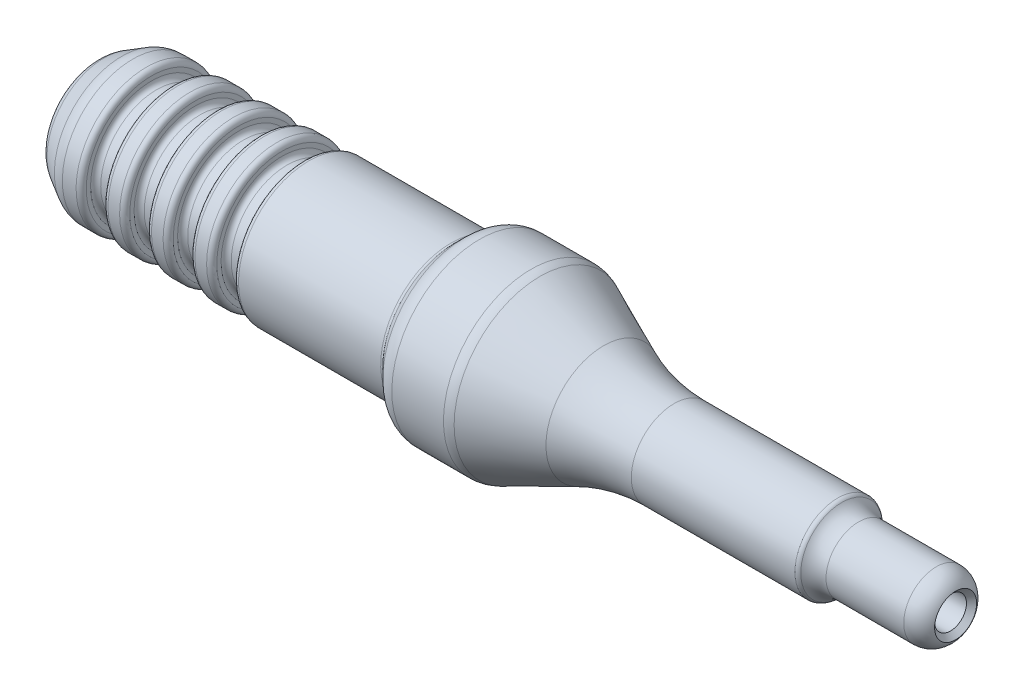
ISO-10303-21;
HEADER;
FILE_DESCRIPTION(('STEP AP214'),'2;1');
FILE_NAME('part.step','',(''),(''),'','','');
FILE_SCHEMA(('AUTOMOTIVE_DESIGN { 1 0 10303 214 1 1 1 1 }'));
ENDSEC;
DATA;
#1=APPLICATION_CONTEXT('core data for automotive mechanical design processes');
#2=APPLICATION_PROTOCOL_DEFINITION('international standard','automotive_design',2000,#1);
#3=PRODUCT_CONTEXT('',#1,'mechanical');
#4=PRODUCT('Part','Part','',(#3));
#5=PRODUCT_RELATED_PRODUCT_CATEGORY('part','',(#4));
#6=PRODUCT_DEFINITION_FORMATION('','',#4);
#7=PRODUCT_DEFINITION_CONTEXT('part definition',#1,'design');
#8=PRODUCT_DEFINITION('design','',#6,#7);
#9=PRODUCT_DEFINITION_SHAPE('','',#8);
#10=(LENGTH_UNIT() NAMED_UNIT(*) SI_UNIT(.MILLI.,.METRE.));
#11=(NAMED_UNIT(*) PLANE_ANGLE_UNIT() SI_UNIT($,.RADIAN.));
#12=(NAMED_UNIT(*) SI_UNIT($,.STERADIAN.) SOLID_ANGLE_UNIT());
#13=UNCERTAINTY_MEASURE_WITH_UNIT(LENGTH_MEASURE(1.E-05),#10,'distance_accuracy_value','');
#14=(GEOMETRIC_REPRESENTATION_CONTEXT(3) GLOBAL_UNCERTAINTY_ASSIGNED_CONTEXT((#13)) GLOBAL_UNIT_ASSIGNED_CONTEXT((#10,
#11,#12)) REPRESENTATION_CONTEXT('',''));
#15=CARTESIAN_POINT('',(0.,0.,0.));
#16=DIRECTION('',(0.,0.,1.));
#17=DIRECTION('',(1.,0.,0.));
#18=AXIS2_PLACEMENT_3D('',#15,#16,#17);
#19=CARTESIAN_POINT('',(59.4526406858628,0.,0.));
#20=DIRECTION('',(1.,0.,0.));
#21=DIRECTION('',(0.,1.,0.));
#22=AXIS2_PLACEMENT_3D('',#19,#20,#21);
#23=CYLINDRICAL_SURFACE('',#22,4.84790561913614);
#24=CARTESIAN_POINT('',(3.65,0.,0.));
#25=DIRECTION('',(-1.,0.,0.));
#26=DIRECTION('',(0.,-1.,0.));
#27=AXIS2_PLACEMENT_3D('',#24,#25,#26);
#28=CIRCLE('',#27,4.84790561913614);
#29=CARTESIAN_POINT('',(3.65,-4.84790561913614,0.));
#30=VERTEX_POINT('',#29);
#31=EDGE_CURVE('E52',#30,#30,#28,.T.);
#32=ORIENTED_EDGE('',*,*,#31,.T.);
#33=EDGE_LOOP('',(#32));
#34=FACE_BOUND('',#33,.T.);
#35=CARTESIAN_POINT('',(2.70192378864668,0.,0.));
#36=DIRECTION('',(-1.,0.,0.));
#37=DIRECTION('',(0.,-1.,0.));
#38=AXIS2_PLACEMENT_3D('',#35,#36,#37);
#39=CIRCLE('',#38,4.84790561913614);
#40=CARTESIAN_POINT('',(2.70192378864668,-4.84790561913614,0.));
#41=VERTEX_POINT('',#40);
#42=EDGE_CURVE('E169',#41,#41,#39,.F.);
#43=ORIENTED_EDGE('',*,*,#42,.T.);
#44=EDGE_LOOP('',(#43));
#45=FACE_BOUND('',#44,.T.);
#46=ADVANCED_FACE('F32',(#34,#45),#23,.T.);
#47=CARTESIAN_POINT('',(24.6550252531694,0.,0.));
#48=DIRECTION('',(1.,0.,0.));
#49=DIRECTION('',(0.,1.,0.));
#50=AXIS2_PLACEMENT_3D('',#47,#48,#49);
#51=CIRCLE('',#50,4.84790561913614);
#52=CARTESIAN_POINT('',(24.6550252531694,4.84790561913614,0.));
#53=VERTEX_POINT('',#52);
#54=EDGE_CURVE('E10',#53,#53,#51,.F.);
#55=ORIENTED_EDGE('',*,*,#54,.T.);
#56=EDGE_LOOP('',(#55));
#57=FACE_BOUND('',#56,.T.);
#58=CARTESIAN_POINT('',(14.85,0.,0.));
#59=DIRECTION('',(1.,0.,0.));
#60=DIRECTION('',(0.,1.,0.));
#61=AXIS2_PLACEMENT_3D('',#58,#59,#60);
#62=CIRCLE('',#61,4.84790561913614);
#63=CARTESIAN_POINT('',(14.85,4.84790561913614,0.));
#64=VERTEX_POINT('',#63);
#65=EDGE_CURVE('E55',#64,#64,#62,.T.);
#66=ORIENTED_EDGE('',*,*,#65,.T.);
#67=EDGE_LOOP('',(#66));
#68=FACE_BOUND('',#67,.T.);
#69=ADVANCED_FACE('F218',(#57,#68),#23,.T.);
#70=CARTESIAN_POINT('',(0.,0.,0.));
#71=DIRECTION('',(-1.,0.,0.));
#72=DIRECTION('',(0.,-1.,0.));
#73=AXIS2_PLACEMENT_3D('',#70,#71,#72);
#74=PLANE('',#73);
#75=CARTESIAN_POINT('',(0.,0.,0.));
#76=DIRECTION('',(-1.,0.,0.));
#77=DIRECTION('',(0.,-1.,0.));
#78=AXIS2_PLACEMENT_3D('',#75,#76,#77);
#79=CIRCLE('',#78,2.65397459621556);
#80=CARTESIAN_POINT('',(0.,-2.65397459621556,0.));
#81=VERTEX_POINT('',#80);
#82=EDGE_CURVE('E160',#81,#81,#79,.T.);
#83=ORIENTED_EDGE('',*,*,#82,.T.);
#84=EDGE_LOOP('',(#83));
#85=FACE_BOUND('',#84,.T.);
#86=CARTESIAN_POINT('',(0.,0.,0.));
#87=DIRECTION('',(-1.,0.,0.));
#88=DIRECTION('',(0.,-1.,0.));
#89=AXIS2_PLACEMENT_3D('',#86,#87,#88);
#90=CIRCLE('',#89,2.6);
#91=CARTESIAN_POINT('',(0.,-2.6,0.));
#92=VERTEX_POINT('',#91);
#93=EDGE_CURVE('E175',#92,#92,#90,.F.);
#94=ORIENTED_EDGE('',*,*,#93,.T.);
#95=EDGE_LOOP('',(#94));
#96=FACE_BOUND('',#95,.T.);
#97=ADVANCED_FACE('F226',(#85,#96),#74,.T.);
#98=CARTESIAN_POINT('',(2.3,0.,0.));
#99=DIRECTION('',(1.,0.,0.));
#100=DIRECTION('',(0.,1.,0.));
#101=AXIS2_PLACEMENT_3D('',#98,#99,#100);
#102=CONICAL_SURFACE('',#101,4.84790561913614,0.523598775598301);
#103=CARTESIAN_POINT('',(1.95192378864668,0.,0.));
#104=DIRECTION('',(-1.,0.,0.));
#105=DIRECTION('',(0.,-1.,0.));
#106=AXIS2_PLACEMENT_3D('',#103,#104,#105);
#107=CIRCLE('',#106,4.6469437248128);
#108=CARTESIAN_POINT('',(1.95192378864668,-4.6469437248128,0.));
#109=VERTEX_POINT('',#108);
#110=EDGE_CURVE('E163',#109,#109,#107,.T.);
#111=ORIENTED_EDGE('',*,*,#110,.T.);
#112=EDGE_LOOP('',(#111));
#113=FACE_BOUND('',#112,.T.);
#114=CARTESIAN_POINT('',(0.749999999999998,0.,0.));
#115=DIRECTION('',(-1.,0.,0.));
#116=DIRECTION('',(0.,-1.,0.));
#117=AXIS2_PLACEMENT_3D('',#114,#115,#116);
#118=CIRCLE('',#117,3.95301270189222);
#119=CARTESIAN_POINT('',(0.749999999999998,-3.95301270189222,0.));
#120=VERTEX_POINT('',#119);
#121=EDGE_CURVE('E166',#120,#120,#118,.F.);
#122=ORIENTED_EDGE('',*,*,#121,.T.);
#123=EDGE_LOOP('',(#122));
#124=FACE_BOUND('',#123,.T.);
#125=ADVANCED_FACE('F318',(#113,#124),#102,.T.);
#126=CARTESIAN_POINT('',(26.,0.,0.));
#127=DIRECTION('',(1.,0.,0.));
#128=DIRECTION('',(0.,1.,0.));
#129=AXIS2_PLACEMENT_3D('',#126,#127,#128);
#130=CONICAL_SURFACE('',#129,6.04790561913615,0.785398163397448);
#131=CARTESIAN_POINT('',(24.9025126265847,0.,0.));
#132=DIRECTION('',(1.,0.,0.));
#133=DIRECTION('',(0.,1.,0.));
#134=AXIS2_PLACEMENT_3D('',#131,#132,#133);
#135=CIRCLE('',#134,4.95041824572085);
#136=CARTESIAN_POINT('',(24.9025126265847,4.95041824572085,0.));
#137=VERTEX_POINT('',#136);
#138=EDGE_CURVE('E39',#137,#137,#135,.T.);
#139=ORIENTED_EDGE('',*,*,#138,.T.);
#140=EDGE_LOOP('',(#139));
#141=FACE_BOUND('',#140,.T.);
#142=CARTESIAN_POINT('',(25.5606601717798,0.,0.));
#143=DIRECTION('',(-1.,0.,0.));
#144=DIRECTION('',(0.,-1.,0.));
#145=AXIS2_PLACEMENT_3D('',#142,#143,#144);
#146=CIRCLE('',#145,5.60856579091597);
#147=CARTESIAN_POINT('',(25.5606601717798,-5.60856579091597,0.));
#148=VERTEX_POINT('',#147);
#149=EDGE_CURVE('E151',#148,#148,#146,.T.);
#150=ORIENTED_EDGE('',*,*,#149,.T.);
#151=EDGE_LOOP('',(#150));
#152=FACE_BOUND('',#151,.T.);
#153=ADVANCED_FACE('F315',(#141,#152),#130,.T.);
#154=CARTESIAN_POINT('',(59.4526406858628,0.,0.));
#155=DIRECTION('',(1.,0.,0.));
#156=DIRECTION('',(0.,1.,0.));
#157=AXIS2_PLACEMENT_3D('',#154,#155,#156);
#158=CYLINDRICAL_SURFACE('',#157,6.04790561913615);
#159=CARTESIAN_POINT('',(26.6213203435596,0.,0.));
#160=DIRECTION('',(-1.,0.,0.));
#161=DIRECTION('',(0.,-1.,0.));
#162=AXIS2_PLACEMENT_3D('',#159,#160,#161);
#163=CIRCLE('',#162,6.04790561913615);
#164=CARTESIAN_POINT('',(26.6213203435596,-6.04790561913615,0.));
#165=VERTEX_POINT('',#164);
#166=EDGE_CURVE('E154',#165,#165,#163,.F.);
#167=ORIENTED_EDGE('',*,*,#166,.T.);
#168=EDGE_LOOP('',(#167));
#169=FACE_BOUND('',#168,.T.);
#170=CARTESIAN_POINT('',(30.182669802533,0.,0.));
#171=DIRECTION('',(-1.,0.,0.));
#172=DIRECTION('',(0.,-1.,0.));
#173=AXIS2_PLACEMENT_3D('',#170,#171,#172);
#174=CIRCLE('',#173,6.04790561913615);
#175=CARTESIAN_POINT('',(30.182669802533,-6.04790561913615,0.));
#176=VERTEX_POINT('',#175);
#177=EDGE_CURVE('E157',#176,#176,#174,.T.);
#178=ORIENTED_EDGE('',*,*,#177,.T.);
#179=EDGE_LOOP('',(#178));
#180=FACE_BOUND('',#179,.T.);
#181=ADVANCED_FACE('F312',(#169,#180),#158,.T.);
#182=CARTESIAN_POINT('',(37.5,0.,0.));
#183=DIRECTION('',(-1.,0.,0.));
#184=DIRECTION('',(0.,-1.,0.));
#185=AXIS2_PLACEMENT_3D('',#182,#183,#184);
#186=CONICAL_SURFACE('',#185,2.94739412510883,0.416959158301446);
#187=CARTESIAN_POINT('',(30.7901428223222,0.,0.));
#188=DIRECTION('',(1.,0.,0.));
#189=DIRECTION('',(0.,1.,0.));
#190=AXIS2_PLACEMENT_3D('',#187,#188,#189);
#191=CIRCLE('',#190,5.91939259691907);
#192=CARTESIAN_POINT('',(30.7901428223222,5.91939259691907,0.));
#193=VERTEX_POINT('',#192);
#194=EDGE_CURVE('E148',#193,#193,#191,.T.);
#195=ORIENTED_EDGE('',*,*,#194,.T.);
#196=EDGE_LOOP('',(#195));
#197=FACE_BOUND('',#196,.T.);
#198=CARTESIAN_POINT('',(35.1788574214223,0.,0.));
#199=DIRECTION('',(-1.,0.,0.));
#200=DIRECTION('',(0.,-1.,0.));
#201=AXIS2_PLACEMENT_3D('',#198,#199,#200);
#202=CIRCLE('',#201,3.97549830284545);
#203=CARTESIAN_POINT('',(35.1788574214223,-3.97549830284545,0.));
#204=VERTEX_POINT('',#203);
#205=EDGE_CURVE('E184',#204,#204,#202,.T.);
#206=ORIENTED_EDGE('',*,*,#205,.T.);
#207=EDGE_LOOP('',(#206));
#208=FACE_BOUND('',#207,.T.);
#209=ADVANCED_FACE('F305',(#197,#208),#186,.T.);
#210=CARTESIAN_POINT('',(59.4526406858628,0.,0.));
#211=DIRECTION('',(1.,0.,0.));
#212=DIRECTION('',(0.,1.,0.));
#213=AXIS2_PLACEMENT_3D('',#210,#211,#212);
#214=CYLINDRICAL_SURFACE('',#213,2.94739412510883);
#215=CARTESIAN_POINT('',(51.3201451434573,0.,0.));
#216=DIRECTION('',(-1.,0.,0.));
#217=DIRECTION('',(0.,-1.,0.));
#218=AXIS2_PLACEMENT_3D('',#215,#216,#217);
#219=CIRCLE('',#218,2.94739412510883);
#220=CARTESIAN_POINT('',(51.3201451434573,-2.94739412510883,0.));
#221=VERTEX_POINT('',#220);
#222=EDGE_CURVE('E43',#221,#221,#219,.T.);
#223=ORIENTED_EDGE('',*,*,#222,.T.);
#224=EDGE_LOOP('',(#223));
#225=FACE_BOUND('',#224,.T.);
#226=CARTESIAN_POINT('',(40.0386415797363,0.,0.));
#227=DIRECTION('',(1.,0.,0.));
#228=DIRECTION('',(0.,1.,0.));
#229=AXIS2_PLACEMENT_3D('',#226,#227,#228);
#230=CIRCLE('',#229,2.94739412510883);
#231=CARTESIAN_POINT('',(40.0386415797363,2.94739412510883,0.));
#232=VERTEX_POINT('',#231);
#233=EDGE_CURVE('E187',#232,#232,#230,.T.);
#234=ORIENTED_EDGE('',*,*,#233,.T.);
#235=EDGE_LOOP('',(#234));
#236=FACE_BOUND('',#235,.T.);
#237=ADVANCED_FACE('F295',(#225,#236),#214,.T.);
#238=CARTESIAN_POINT('',(59.4526406858628,0.,0.));
#239=DIRECTION('',(1.,0.,0.));
#240=DIRECTION('',(0.,1.,0.));
#241=AXIS2_PLACEMENT_3D('',#238,#239,#240);
#242=CYLINDRICAL_SURFACE('',#241,2.25);
#243=CARTESIAN_POINT('',(58.1259907697207,0.,0.));
#244=DIRECTION('',(1.,0.,0.));
#245=DIRECTION('',(0.,1.,0.));
#246=AXIS2_PLACEMENT_3D('',#243,#244,#245);
#247=CIRCLE('',#246,2.25);
#248=CARTESIAN_POINT('',(58.1259907697207,2.25,0.));
#249=VERTEX_POINT('',#248);
#250=EDGE_CURVE('E142',#249,#249,#247,.F.);
#251=ORIENTED_EDGE('',*,*,#250,.T.);
#252=EDGE_LOOP('',(#251));
#253=FACE_BOUND('',#252,.T.);
#254=CARTESIAN_POINT('',(52.7672110359329,0.,0.));
#255=DIRECTION('',(-1.,0.,0.));
#256=DIRECTION('',(0.,-1.,0.));
#257=AXIS2_PLACEMENT_3D('',#254,#255,#256);
#258=CIRCLE('',#257,2.25);
#259=CARTESIAN_POINT('',(52.7672110359329,-2.25,0.));
#260=VERTEX_POINT('',#259);
#261=EDGE_CURVE('E145',#260,#260,#258,.F.);
#262=ORIENTED_EDGE('',*,*,#261,.T.);
#263=EDGE_LOOP('',(#262));
#264=FACE_BOUND('',#263,.T.);
#265=ADVANCED_FACE('F292',(#253,#264),#242,.T.);
#266=CARTESIAN_POINT('',(59.4526406858628,0.,0.));
#267=DIRECTION('',(1.,0.,0.));
#268=DIRECTION('',(0.,1.,0.));
#269=AXIS2_PLACEMENT_3D('',#266,#267,#268);
#270=CYLINDRICAL_SURFACE('',#269,2.25);
#271=CARTESIAN_POINT('',(0.350000000000003,0.,0.));
#272=DIRECTION('',(-1.,0.,0.));
#273=DIRECTION('',(0.,-1.,0.));
#274=AXIS2_PLACEMENT_3D('',#271,#272,#273);
#275=CIRCLE('',#274,2.25);
#276=CARTESIAN_POINT('',(0.350000000000003,-2.25,0.));
#277=VERTEX_POINT('',#276);
#278=EDGE_CURVE('E172',#277,#277,#275,.T.);
#279=ORIENTED_EDGE('',*,*,#278,.T.);
#280=EDGE_LOOP('',(#279));
#281=FACE_BOUND('',#280,.T.);
#282=CARTESIAN_POINT('',(33.5,0.,0.));
#283=DIRECTION('',(1.,0.,0.));
#284=DIRECTION('',(0.,1.,0.));
#285=AXIS2_PLACEMENT_3D('',#282,#283,#284);
#286=CIRCLE('',#285,2.25);
#287=CARTESIAN_POINT('',(33.5,2.25,0.));
#288=VERTEX_POINT('',#287);
#289=EDGE_CURVE('E190',#288,#288,#286,.T.);
#290=ORIENTED_EDGE('',*,*,#289,.T.);
#291=EDGE_LOOP('',(#290));
#292=FACE_BOUND('',#291,.T.);
#293=ADVANCED_FACE('F294',(#281,#292),#270,.F.);
#294=CARTESIAN_POINT('',(35.4918584287042,0.,0.));
#295=DIRECTION('',(-1.,0.,0.));
#296=DIRECTION('',(0.,-1.,0.));
#297=AXIS2_PLACEMENT_3D('',#294,#295,#296);
#298=CONICAL_SURFACE('',#297,1.1,0.5235987755983);
#299=ORIENTED_EDGE('',*,*,#289,.F.);
#300=EDGE_LOOP('',(#299));
#301=FACE_BOUND('',#300,.T.);
#302=CARTESIAN_POINT('',(35.4918584287042,0.,0.));
#303=DIRECTION('',(1.,0.,0.));
#304=DIRECTION('',(0.,1.,0.));
#305=AXIS2_PLACEMENT_3D('',#302,#303,#304);
#306=CIRCLE('',#305,1.1);
#307=CARTESIAN_POINT('',(35.4918584287042,1.1,0.));
#308=VERTEX_POINT('',#307);
#309=EDGE_CURVE('E193',#308,#308,#306,.T.);
#310=ORIENTED_EDGE('',*,*,#309,.T.);
#311=EDGE_LOOP('',(#310));
#312=FACE_BOUND('',#311,.T.);
#313=ADVANCED_FACE('F302',(#301,#312),#298,.F.);
#314=CARTESIAN_POINT('',(59.4526406858628,0.,0.));
#315=DIRECTION('',(1.,0.,0.));
#316=DIRECTION('',(0.,1.,0.));
#317=AXIS2_PLACEMENT_3D('',#314,#315,#316);
#318=CYLINDRICAL_SURFACE('',#317,1.1);
#319=CARTESIAN_POINT('',(59.1026406858628,0.,0.));
#320=DIRECTION('',(1.,0.,0.));
#321=DIRECTION('',(0.,1.,0.));
#322=AXIS2_PLACEMENT_3D('',#319,#320,#321);
#323=CIRCLE('',#322,1.1);
#324=CARTESIAN_POINT('',(59.1026406858628,1.1,0.));
#325=VERTEX_POINT('',#324);
#326=EDGE_CURVE('E181',#325,#325,#323,.T.);
#327=ORIENTED_EDGE('',*,*,#326,.T.);
#328=EDGE_LOOP('',(#327));
#329=FACE_BOUND('',#328,.T.);
#330=ORIENTED_EDGE('',*,*,#309,.F.);
#331=EDGE_LOOP('',(#330));
#332=FACE_BOUND('',#331,.T.);
#333=ADVANCED_FACE('F449',(#329,#332),#318,.F.);
#334=CARTESIAN_POINT('',(14.5,4.84790561913614,0.));
#335=DIRECTION('',(1.,0.,0.));
#336=DIRECTION('',(0.,1.,0.));
#337=AXIS2_PLACEMENT_3D('',#334,#335,#336);
#338=PLANE('',#337);
#339=CARTESIAN_POINT('',(14.5,0.,0.));
#340=DIRECTION('',(1.,0.,0.));
#341=DIRECTION('',(0.,1.,0.));
#342=AXIS2_PLACEMENT_3D('',#339,#340,#341);
#343=CIRCLE('',#342,4.19790561913614);
#344=CARTESIAN_POINT('',(14.5,4.19790561913614,0.));
#345=VERTEX_POINT('',#344);
#346=EDGE_CURVE('E115',#345,#345,#343,.T.);
#347=ORIENTED_EDGE('',*,*,#346,.T.);
#348=EDGE_LOOP('',(#347));
#349=FACE_BOUND('',#348,.T.);
#350=CARTESIAN_POINT('',(14.5,0.,0.));
#351=DIRECTION('',(1.,0.,0.));
#352=DIRECTION('',(0.,1.,0.));
#353=AXIS2_PLACEMENT_3D('',#350,#351,#352);
#354=CIRCLE('',#353,4.49790561913614);
#355=CARTESIAN_POINT('',(14.5,4.49790561913614,0.));
#356=VERTEX_POINT('',#355);
#357=EDGE_CURVE('E118',#356,#356,#354,.F.);
#358=ORIENTED_EDGE('',*,*,#357,.T.);
#359=EDGE_LOOP('',(#358));
#360=FACE_BOUND('',#359,.T.);
#361=ADVANCED_FACE('F445',(#349,#360),#338,.F.);
#362=CARTESIAN_POINT('',(59.4526406858628,0.,0.));
#363=DIRECTION('',(1.,0.,0.));
#364=DIRECTION('',(0.,1.,0.));
#365=AXIS2_PLACEMENT_3D('',#362,#363,#364);
#366=CYLINDRICAL_SURFACE('',#365,3.84790561913614);
#367=CARTESIAN_POINT('',(13.35,0.,0.));
#368=DIRECTION('',(-1.,0.,0.));
#369=DIRECTION('',(0.,-1.,0.));
#370=AXIS2_PLACEMENT_3D('',#367,#368,#369);
#371=CIRCLE('',#370,3.84790561913614);
#372=CARTESIAN_POINT('',(13.35,-3.84790561913614,0.));
#373=VERTEX_POINT('',#372);
#374=EDGE_CURVE('E127',#373,#373,#371,.F.);
#375=ORIENTED_EDGE('',*,*,#374,.T.);
#376=EDGE_LOOP('',(#375));
#377=FACE_BOUND('',#376,.T.);
#378=CARTESIAN_POINT('',(14.15,0.,0.));
#379=DIRECTION('',(1.,0.,0.));
#380=DIRECTION('',(0.,1.,0.));
#381=AXIS2_PLACEMENT_3D('',#378,#379,#380);
#382=CIRCLE('',#381,3.84790561913614);
#383=CARTESIAN_POINT('',(14.15,3.84790561913614,0.));
#384=VERTEX_POINT('',#383);
#385=EDGE_CURVE('E130',#384,#384,#382,.F.);
#386=ORIENTED_EDGE('',*,*,#385,.T.);
#387=EDGE_LOOP('',(#386));
#388=FACE_BOUND('',#387,.T.);
#389=ADVANCED_FACE('F441',(#377,#388),#366,.T.);
#390=CARTESIAN_POINT('',(13.,4.84790561913614,0.));
#391=DIRECTION('',(-1.,0.,0.));
#392=DIRECTION('',(0.,-1.,0.));
#393=AXIS2_PLACEMENT_3D('',#390,#391,#392);
#394=PLANE('',#393);
#395=CARTESIAN_POINT('',(13.,0.,0.));
#396=DIRECTION('',(-1.,0.,0.));
#397=DIRECTION('',(0.,-1.,0.));
#398=AXIS2_PLACEMENT_3D('',#395,#396,#397);
#399=CIRCLE('',#398,4.19790561913614);
#400=CARTESIAN_POINT('',(13.,-4.19790561913614,0.));
#401=VERTEX_POINT('',#400);
#402=EDGE_CURVE('E121',#401,#401,#399,.T.);
#403=ORIENTED_EDGE('',*,*,#402,.T.);
#404=EDGE_LOOP('',(#403));
#405=FACE_BOUND('',#404,.T.);
#406=CARTESIAN_POINT('',(13.,0.,0.));
#407=DIRECTION('',(-1.,0.,0.));
#408=DIRECTION('',(0.,-1.,0.));
#409=AXIS2_PLACEMENT_3D('',#406,#407,#408);
#410=CIRCLE('',#409,4.49790561913614);
#411=CARTESIAN_POINT('',(13.,-4.49790561913614,0.));
#412=VERTEX_POINT('',#411);
#413=EDGE_CURVE('E124',#412,#412,#410,.F.);
#414=ORIENTED_EDGE('',*,*,#413,.T.);
#415=EDGE_LOOP('',(#414));
#416=FACE_BOUND('',#415,.T.);
#417=ADVANCED_FACE('F214',(#405,#416),#394,.F.);
#418=CARTESIAN_POINT('',(4.,4.84790561913614,0.));
#419=DIRECTION('',(-1.,0.,0.));
#420=DIRECTION('',(0.,-1.,0.));
#421=AXIS2_PLACEMENT_3D('',#418,#419,#420);
#422=PLANE('',#421);
#423=CARTESIAN_POINT('',(4.,0.,0.));
#424=DIRECTION('',(-1.,0.,0.));
#425=DIRECTION('',(0.,-1.,0.));
#426=AXIS2_PLACEMENT_3D('',#423,#424,#425);
#427=CIRCLE('',#426,4.19790561913614);
#428=CARTESIAN_POINT('',(4.,-4.19790561913614,0.));
#429=VERTEX_POINT('',#428);
#430=EDGE_CURVE('E133',#429,#429,#427,.T.);
#431=ORIENTED_EDGE('',*,*,#430,.T.);
#432=EDGE_LOOP('',(#431));
#433=FACE_BOUND('',#432,.T.);
#434=CARTESIAN_POINT('',(4.,0.,0.));
#435=DIRECTION('',(-1.,0.,0.));
#436=DIRECTION('',(0.,-1.,0.));
#437=AXIS2_PLACEMENT_3D('',#434,#435,#436);
#438=CIRCLE('',#437,4.49790561913614);
#439=CARTESIAN_POINT('',(4.,-4.49790561913614,0.));
#440=VERTEX_POINT('',#439);
#441=EDGE_CURVE('E136',#440,#440,#438,.F.);
#442=ORIENTED_EDGE('',*,*,#441,.T.);
#443=EDGE_LOOP('',(#442));
#444=FACE_BOUND('',#443,.T.);
#445=ADVANCED_FACE('F204',(#433,#444),#422,.F.);
#446=CARTESIAN_POINT('',(59.4526406858628,0.,0.));
#447=DIRECTION('',(1.,0.,0.));
#448=DIRECTION('',(0.,1.,0.));
#449=AXIS2_PLACEMENT_3D('',#446,#447,#448);
#450=CYLINDRICAL_SURFACE('',#449,3.84790561913614);
#451=CARTESIAN_POINT('',(4.35,0.,0.));
#452=DIRECTION('',(-1.,0.,0.));
#453=DIRECTION('',(0.,-1.,0.));
#454=AXIS2_PLACEMENT_3D('',#451,#452,#453);
#455=CIRCLE('',#454,3.84790561913614);
#456=CARTESIAN_POINT('',(4.35,-3.84790561913614,0.));
#457=VERTEX_POINT('',#456);
#458=EDGE_CURVE('E139',#457,#457,#455,.F.);
#459=ORIENTED_EDGE('',*,*,#458,.T.);
#460=EDGE_LOOP('',(#459));
#461=FACE_BOUND('',#460,.T.);
#462=CARTESIAN_POINT('',(5.5,0.,0.));
#463=DIRECTION('',(1.,0.,0.));
#464=DIRECTION('',(0.,1.,0.));
#465=AXIS2_PLACEMENT_3D('',#462,#463,#464);
#466=CIRCLE('',#465,3.84790561913614);
#467=CARTESIAN_POINT('',(5.5,3.84790561913614,0.));
#468=VERTEX_POINT('',#467);
#469=EDGE_CURVE('E196',#468,#468,#466,.T.);
#470=ORIENTED_EDGE('',*,*,#469,.F.);
#471=EDGE_LOOP('',(#470));
#472=FACE_BOUND('',#471,.T.);
#473=ADVANCED_FACE('F202',(#461,#472),#450,.T.);
#474=CARTESIAN_POINT('',(5.5,4.84790561913614,0.));
#475=DIRECTION('',(1.,0.,0.));
#476=DIRECTION('',(0.,1.,0.));
#477=AXIS2_PLACEMENT_3D('',#474,#475,#476);
#478=PLANE('',#477);
#479=CARTESIAN_POINT('',(5.5,0.,0.));
#480=DIRECTION('',(1.,0.,0.));
#481=DIRECTION('',(0.,1.,0.));
#482=AXIS2_PLACEMENT_3D('',#479,#480,#481);
#483=CIRCLE('',#482,4.49790561913614);
#484=CARTESIAN_POINT('',(5.5,4.49790561913614,0.));
#485=VERTEX_POINT('',#484);
#486=EDGE_CURVE('E58',#485,#485,#483,.F.);
#487=ORIENTED_EDGE('',*,*,#486,.T.);
#488=EDGE_LOOP('',(#487));
#489=FACE_BOUND('',#488,.T.);
#490=ORIENTED_EDGE('',*,*,#469,.T.);
#491=EDGE_LOOP('',(#490));
#492=FACE_BOUND('',#491,.T.);
#493=ADVANCED_FACE('F200',(#489,#492),#478,.F.);
#494=CARTESIAN_POINT('',(12.65,0.,0.));
#495=DIRECTION('',(-1.,0.,0.));
#496=DIRECTION('',(0.,-1.,0.));
#497=AXIS2_PLACEMENT_3D('',#494,#495,#496);
#498=CIRCLE('',#497,4.84790561913614);
#499=CARTESIAN_POINT('',(12.65,-4.84790561913614,0.));
#500=VERTEX_POINT('',#499);
#501=EDGE_CURVE('E109',#500,#500,#498,.T.);
#502=ORIENTED_EDGE('',*,*,#501,.T.);
#503=EDGE_LOOP('',(#502));
#504=FACE_BOUND('',#503,.T.);
#505=CARTESIAN_POINT('',(11.85,0.,0.));
#506=DIRECTION('',(1.,0.,0.));
#507=DIRECTION('',(0.,1.,0.));
#508=AXIS2_PLACEMENT_3D('',#505,#506,#507);
#509=CIRCLE('',#508,4.84790561913614);
#510=CARTESIAN_POINT('',(11.85,4.84790561913614,0.));
#511=VERTEX_POINT('',#510);
#512=EDGE_CURVE('E112',#511,#511,#509,.T.);
#513=ORIENTED_EDGE('',*,*,#512,.T.);
#514=EDGE_LOOP('',(#513));
#515=FACE_BOUND('',#514,.T.);
#516=ADVANCED_FACE('F211',(#504,#515),#23,.T.);
#517=CARTESIAN_POINT('',(11.5,4.84790561913614,0.));
#518=DIRECTION('',(1.,0.,0.));
#519=DIRECTION('',(0.,1.,0.));
#520=AXIS2_PLACEMENT_3D('',#517,#518,#519);
#521=PLANE('',#520);
#522=CARTESIAN_POINT('',(11.5,0.,0.));
#523=DIRECTION('',(1.,0.,0.));
#524=DIRECTION('',(0.,1.,0.));
#525=AXIS2_PLACEMENT_3D('',#522,#523,#524);
#526=CIRCLE('',#525,4.49790561913614);
#527=CARTESIAN_POINT('',(11.5,4.49790561913614,0.));
#528=VERTEX_POINT('',#527);
#529=EDGE_CURVE('E103',#528,#528,#526,.F.);
#530=ORIENTED_EDGE('',*,*,#529,.T.);
#531=EDGE_LOOP('',(#530));
#532=FACE_BOUND('',#531,.T.);
#533=CARTESIAN_POINT('',(11.5,0.,0.));
#534=DIRECTION('',(1.,0.,0.));
#535=DIRECTION('',(0.,1.,0.));
#536=AXIS2_PLACEMENT_3D('',#533,#534,#535);
#537=CIRCLE('',#536,4.19790561913614);
#538=CARTESIAN_POINT('',(11.5,4.19790561913614,0.));
#539=VERTEX_POINT('',#538);
#540=EDGE_CURVE('E106',#539,#539,#537,.T.);
#541=ORIENTED_EDGE('',*,*,#540,.T.);
#542=EDGE_LOOP('',(#541));
#543=FACE_BOUND('',#542,.T.);
#544=ADVANCED_FACE('F434',(#532,#543),#521,.F.);
#545=CARTESIAN_POINT('',(59.4526406858628,0.,0.));
#546=DIRECTION('',(1.,0.,0.));
#547=DIRECTION('',(0.,1.,0.));
#548=AXIS2_PLACEMENT_3D('',#545,#546,#547);
#549=CYLINDRICAL_SURFACE('',#548,3.84790561913614);
#550=CARTESIAN_POINT('',(10.35,0.,0.));
#551=DIRECTION('',(-1.,0.,0.));
#552=DIRECTION('',(0.,-1.,0.));
#553=AXIS2_PLACEMENT_3D('',#550,#551,#552);
#554=CIRCLE('',#553,3.84790561913614);
#555=CARTESIAN_POINT('',(10.35,-3.84790561913614,0.));
#556=VERTEX_POINT('',#555);
#557=EDGE_CURVE('E97',#556,#556,#554,.F.);
#558=ORIENTED_EDGE('',*,*,#557,.T.);
#559=EDGE_LOOP('',(#558));
#560=FACE_BOUND('',#559,.T.);
#561=CARTESIAN_POINT('',(11.15,0.,0.));
#562=DIRECTION('',(1.,0.,0.));
#563=DIRECTION('',(0.,1.,0.));
#564=AXIS2_PLACEMENT_3D('',#561,#562,#563);
#565=CIRCLE('',#564,3.84790561913614);
#566=CARTESIAN_POINT('',(11.15,3.84790561913614,0.));
#567=VERTEX_POINT('',#566);
#568=EDGE_CURVE('E100',#567,#567,#565,.F.);
#569=ORIENTED_EDGE('',*,*,#568,.T.);
#570=EDGE_LOOP('',(#569));
#571=FACE_BOUND('',#570,.T.);
#572=ADVANCED_FACE('F245',(#560,#571),#549,.T.);
#573=CARTESIAN_POINT('',(10.,4.84790561913614,0.));
#574=DIRECTION('',(-1.,0.,0.));
#575=DIRECTION('',(0.,-1.,0.));
#576=AXIS2_PLACEMENT_3D('',#573,#574,#575);
#577=PLANE('',#576);
#578=CARTESIAN_POINT('',(10.,0.,0.));
#579=DIRECTION('',(-1.,0.,0.));
#580=DIRECTION('',(0.,-1.,0.));
#581=AXIS2_PLACEMENT_3D('',#578,#579,#580);
#582=CIRCLE('',#581,4.19790561913614);
#583=CARTESIAN_POINT('',(10.,-4.19790561913614,0.));
#584=VERTEX_POINT('',#583);
#585=EDGE_CURVE('E91',#584,#584,#582,.T.);
#586=ORIENTED_EDGE('',*,*,#585,.T.);
#587=EDGE_LOOP('',(#586));
#588=FACE_BOUND('',#587,.T.);
#589=CARTESIAN_POINT('',(10.,0.,0.));
#590=DIRECTION('',(-1.,0.,0.));
#591=DIRECTION('',(0.,-1.,0.));
#592=AXIS2_PLACEMENT_3D('',#589,#590,#591);
#593=CIRCLE('',#592,4.49790561913614);
#594=CARTESIAN_POINT('',(10.,-4.49790561913614,0.));
#595=VERTEX_POINT('',#594);
#596=EDGE_CURVE('E94',#595,#595,#593,.F.);
#597=ORIENTED_EDGE('',*,*,#596,.T.);
#598=EDGE_LOOP('',(#597));
#599=FACE_BOUND('',#598,.T.);
#600=ADVANCED_FACE('F236',(#588,#599),#577,.F.);
#601=CARTESIAN_POINT('',(6.65,0.,0.));
#602=DIRECTION('',(-1.,0.,0.));
#603=DIRECTION('',(0.,-1.,0.));
#604=AXIS2_PLACEMENT_3D('',#601,#602,#603);
#605=CIRCLE('',#604,4.84790561913614);
#606=CARTESIAN_POINT('',(6.65,-4.84790561913614,0.));
#607=VERTEX_POINT('',#606);
#608=EDGE_CURVE('E61',#607,#607,#605,.T.);
#609=ORIENTED_EDGE('',*,*,#608,.T.);
#610=EDGE_LOOP('',(#609));
#611=FACE_BOUND('',#610,.T.);
#612=CARTESIAN_POINT('',(5.85,0.,0.));
#613=DIRECTION('',(1.,0.,0.));
#614=DIRECTION('',(0.,1.,0.));
#615=AXIS2_PLACEMENT_3D('',#612,#613,#614);
#616=CIRCLE('',#615,4.84790561913614);
#617=CARTESIAN_POINT('',(5.85,4.84790561913614,0.));
#618=VERTEX_POINT('',#617);
#619=EDGE_CURVE('E64',#618,#618,#616,.T.);
#620=ORIENTED_EDGE('',*,*,#619,.T.);
#621=EDGE_LOOP('',(#620));
#622=FACE_BOUND('',#621,.T.);
#623=ADVANCED_FACE('F222',(#611,#622),#23,.T.);
#624=CARTESIAN_POINT('',(8.5,4.84790561913614,0.));
#625=DIRECTION('',(1.,0.,0.));
#626=DIRECTION('',(0.,1.,0.));
#627=AXIS2_PLACEMENT_3D('',#624,#625,#626);
#628=PLANE('',#627);
#629=CARTESIAN_POINT('',(8.5,0.,0.));
#630=DIRECTION('',(1.,0.,0.));
#631=DIRECTION('',(0.,1.,0.));
#632=AXIS2_PLACEMENT_3D('',#629,#630,#631);
#633=CIRCLE('',#632,4.49790561913614);
#634=CARTESIAN_POINT('',(8.5,4.49790561913614,0.));
#635=VERTEX_POINT('',#634);
#636=EDGE_CURVE('E79',#635,#635,#633,.F.);
#637=ORIENTED_EDGE('',*,*,#636,.T.);
#638=EDGE_LOOP('',(#637));
#639=FACE_BOUND('',#638,.T.);
#640=CARTESIAN_POINT('',(8.5,0.,0.));
#641=DIRECTION('',(1.,0.,0.));
#642=DIRECTION('',(0.,1.,0.));
#643=AXIS2_PLACEMENT_3D('',#640,#641,#642);
#644=CIRCLE('',#643,4.19790561913614);
#645=CARTESIAN_POINT('',(8.5,4.19790561913614,0.));
#646=VERTEX_POINT('',#645);
#647=EDGE_CURVE('E82',#646,#646,#644,.T.);
#648=ORIENTED_EDGE('',*,*,#647,.T.);
#649=EDGE_LOOP('',(#648));
#650=FACE_BOUND('',#649,.T.);
#651=ADVANCED_FACE('F235',(#639,#650),#628,.F.);
#652=CARTESIAN_POINT('',(59.4526406858628,0.,0.));
#653=DIRECTION('',(1.,0.,0.));
#654=DIRECTION('',(0.,1.,0.));
#655=AXIS2_PLACEMENT_3D('',#652,#653,#654);
#656=CYLINDRICAL_SURFACE('',#655,3.84790561913614);
#657=CARTESIAN_POINT('',(7.35,0.,0.));
#658=DIRECTION('',(-1.,0.,0.));
#659=DIRECTION('',(0.,-1.,0.));
#660=AXIS2_PLACEMENT_3D('',#657,#658,#659);
#661=CIRCLE('',#660,3.84790561913614);
#662=CARTESIAN_POINT('',(7.35,-3.84790561913614,0.));
#663=VERTEX_POINT('',#662);
#664=EDGE_CURVE('E73',#663,#663,#661,.F.);
#665=ORIENTED_EDGE('',*,*,#664,.T.);
#666=EDGE_LOOP('',(#665));
#667=FACE_BOUND('',#666,.T.);
#668=CARTESIAN_POINT('',(8.15,0.,0.));
#669=DIRECTION('',(1.,0.,0.));
#670=DIRECTION('',(0.,1.,0.));
#671=AXIS2_PLACEMENT_3D('',#668,#669,#670);
#672=CIRCLE('',#671,3.84790561913614);
#673=CARTESIAN_POINT('',(8.15,3.84790561913614,0.));
#674=VERTEX_POINT('',#673);
#675=EDGE_CURVE('E76',#674,#674,#672,.F.);
#676=ORIENTED_EDGE('',*,*,#675,.T.);
#677=EDGE_LOOP('',(#676));
#678=FACE_BOUND('',#677,.T.);
#679=ADVANCED_FACE('F242',(#667,#678),#656,.T.);
#680=CARTESIAN_POINT('',(7.,4.84790561913614,0.));
#681=DIRECTION('',(-1.,0.,0.));
#682=DIRECTION('',(0.,-1.,0.));
#683=AXIS2_PLACEMENT_3D('',#680,#681,#682);
#684=PLANE('',#683);
#685=CARTESIAN_POINT('',(7.,0.,0.));
#686=DIRECTION('',(-1.,0.,0.));
#687=DIRECTION('',(0.,-1.,0.));
#688=AXIS2_PLACEMENT_3D('',#685,#686,#687);
#689=CIRCLE('',#688,4.19790561913614);
#690=CARTESIAN_POINT('',(7.,-4.19790561913614,0.));
#691=VERTEX_POINT('',#690);
#692=EDGE_CURVE('E67',#691,#691,#689,.T.);
#693=ORIENTED_EDGE('',*,*,#692,.T.);
#694=EDGE_LOOP('',(#693));
#695=FACE_BOUND('',#694,.T.);
#696=CARTESIAN_POINT('',(7.,0.,0.));
#697=DIRECTION('',(-1.,0.,0.));
#698=DIRECTION('',(0.,-1.,0.));
#699=AXIS2_PLACEMENT_3D('',#696,#697,#698);
#700=CIRCLE('',#699,4.49790561913614);
#701=CARTESIAN_POINT('',(7.,-4.49790561913614,0.));
#702=VERTEX_POINT('',#701);
#703=EDGE_CURVE('E70',#702,#702,#700,.F.);
#704=ORIENTED_EDGE('',*,*,#703,.T.);
#705=EDGE_LOOP('',(#704));
#706=FACE_BOUND('',#705,.T.);
#707=ADVANCED_FACE('F232',(#695,#706),#684,.F.);
#708=CARTESIAN_POINT('',(9.65,0.,0.));
#709=DIRECTION('',(-1.,0.,0.));
#710=DIRECTION('',(0.,-1.,0.));
#711=AXIS2_PLACEMENT_3D('',#708,#709,#710);
#712=CIRCLE('',#711,4.84790561913614);
#713=CARTESIAN_POINT('',(9.65,-4.84790561913614,0.));
#714=VERTEX_POINT('',#713);
#715=EDGE_CURVE('E85',#714,#714,#712,.T.);
#716=ORIENTED_EDGE('',*,*,#715,.T.);
#717=EDGE_LOOP('',(#716));
#718=FACE_BOUND('',#717,.T.);
#719=CARTESIAN_POINT('',(8.85,0.,0.));
#720=DIRECTION('',(1.,0.,0.));
#721=DIRECTION('',(0.,1.,0.));
#722=AXIS2_PLACEMENT_3D('',#719,#720,#721);
#723=CIRCLE('',#722,4.84790561913614);
#724=CARTESIAN_POINT('',(8.85,4.84790561913614,0.));
#725=VERTEX_POINT('',#724);
#726=EDGE_CURVE('E88',#725,#725,#723,.T.);
#727=ORIENTED_EDGE('',*,*,#726,.T.);
#728=EDGE_LOOP('',(#727));
#729=FACE_BOUND('',#728,.T.);
#730=ADVANCED_FACE('F221',(#718,#729),#23,.T.);
#731=CARTESIAN_POINT('',(40.0386415797363,0.,0.));
#732=DIRECTION('',(1.,0.,0.));
#733=DIRECTION('',(0.,1.,0.));
#734=AXIS2_PLACEMENT_3D('',#731,#732,#733);
#735=TOROIDAL_SURFACE('',#734,14.9473941251088,12.);
#736=ORIENTED_EDGE('',*,*,#205,.F.);
#737=EDGE_LOOP('',(#736));
#738=FACE_BOUND('',#737,.T.);
#739=ORIENTED_EDGE('',*,*,#233,.F.);
#740=EDGE_LOOP('',(#739));
#741=FACE_BOUND('',#740,.T.);
#742=ADVANCED_FACE('F231',(#738,#741),#735,.F.);
#743=CARTESIAN_POINT('',(59.1026406858628,0.,0.));
#744=DIRECTION('',(1.,0.,0.));
#745=DIRECTION('',(0.,1.,0.));
#746=AXIS2_PLACEMENT_3D('',#743,#744,#745);
#747=CONICAL_SURFACE('',#746,1.1,0.785398163397458);
#748=CARTESIAN_POINT('',(59.4526406858628,0.,0.));
#749=DIRECTION('',(1.,0.,0.));
#750=DIRECTION('',(0.,1.,0.));
#751=AXIS2_PLACEMENT_3D('',#748,#749,#750);
#752=CIRCLE('',#751,1.45000000000001);
#753=CARTESIAN_POINT('',(59.4526406858628,1.45000000000001,0.));
#754=VERTEX_POINT('',#753);
#755=EDGE_CURVE('E178',#754,#754,#752,.F.);
#756=ORIENTED_EDGE('',*,*,#755,.F.);
#757=EDGE_LOOP('',(#756));
#758=FACE_BOUND('',#757,.T.);
#759=ORIENTED_EDGE('',*,*,#326,.F.);
#760=EDGE_LOOP('',(#759));
#761=FACE_BOUND('',#760,.T.);
#762=ADVANCED_FACE('F345',(#758,#761),#747,.F.);
#763=CARTESIAN_POINT('',(0.,0.,0.));
#764=DIRECTION('',(-1.,0.,0.));
#765=DIRECTION('',(0.,-1.,0.));
#766=AXIS2_PLACEMENT_3D('',#763,#764,#765);
#767=CONICAL_SURFACE('',#766,2.6,0.785398163397451);
#768=ORIENTED_EDGE('',*,*,#278,.F.);
#769=EDGE_LOOP('',(#768));
#770=FACE_BOUND('',#769,.T.);
#771=ORIENTED_EDGE('',*,*,#93,.F.);
#772=EDGE_LOOP('',(#771));
#773=FACE_BOUND('',#772,.T.);
#774=ADVANCED_FACE('F352',(#770,#773),#767,.F.);
#775=CARTESIAN_POINT('',(2.70192378864668,0.,0.));
#776=DIRECTION('',(-1.,0.,0.));
#777=DIRECTION('',(0.,-1.,0.));
#778=AXIS2_PLACEMENT_3D('',#775,#776,#777);
#779=TOROIDAL_SURFACE('',#778,3.34790561913614,1.5);
#780=ORIENTED_EDGE('',*,*,#110,.F.);
#781=EDGE_LOOP('',(#780));
#782=FACE_BOUND('',#781,.T.);
#783=ORIENTED_EDGE('',*,*,#42,.F.);
#784=EDGE_LOOP('',(#783));
#785=FACE_BOUND('',#784,.T.);
#786=ADVANCED_FACE('F365',(#782,#785),#779,.T.);
#787=CARTESIAN_POINT('',(1.5,0.,0.));
#788=DIRECTION('',(-1.,0.,0.));
#789=DIRECTION('',(0.,-1.,0.));
#790=AXIS2_PLACEMENT_3D('',#787,#788,#789);
#791=TOROIDAL_SURFACE('',#790,2.65397459621556,1.5);
#792=ORIENTED_EDGE('',*,*,#82,.F.);
#793=EDGE_LOOP('',(#792));
#794=FACE_BOUND('',#793,.T.);
#795=ORIENTED_EDGE('',*,*,#121,.F.);
#796=EDGE_LOOP('',(#795));
#797=FACE_BOUND('',#796,.T.);
#798=ADVANCED_FACE('F330',(#794,#797),#791,.T.);
#799=CARTESIAN_POINT('',(26.6213203435596,0.,0.));
#800=DIRECTION('',(-1.,0.,0.));
#801=DIRECTION('',(0.,-1.,0.));
#802=AXIS2_PLACEMENT_3D('',#799,#800,#801);
#803=TOROIDAL_SURFACE('',#802,4.54790561913615,1.5);
#804=ORIENTED_EDGE('',*,*,#149,.F.);
#805=EDGE_LOOP('',(#804));
#806=FACE_BOUND('',#805,.T.);
#807=ORIENTED_EDGE('',*,*,#166,.F.);
#808=EDGE_LOOP('',(#807));
#809=FACE_BOUND('',#808,.T.);
#810=ADVANCED_FACE('F326',(#806,#809),#803,.T.);
#811=CARTESIAN_POINT('',(30.182669802533,0.,0.));
#812=DIRECTION('',(-1.,0.,0.));
#813=DIRECTION('',(0.,-1.,0.));
#814=AXIS2_PLACEMENT_3D('',#811,#812,#813);
#815=TOROIDAL_SURFACE('',#814,4.54790561913615,1.5);
#816=ORIENTED_EDGE('',*,*,#177,.F.);
#817=EDGE_LOOP('',(#816));
#818=FACE_BOUND('',#817,.T.);
#819=ORIENTED_EDGE('',*,*,#194,.F.);
#820=EDGE_LOOP('',(#819));
#821=FACE_BOUND('',#820,.T.);
#822=ADVANCED_FACE('F329',(#818,#821),#815,.T.);
#823=CARTESIAN_POINT('',(58.1259907697207,0.,0.));
#824=DIRECTION('',(1.,0.,0.));
#825=DIRECTION('',(0.,1.,0.));
#826=AXIS2_PLACEMENT_3D('',#823,#824,#825);
#827=DEGENERATE_TOROIDAL_SURFACE('',#826,0.749999999999998,1.5,.T.);
#828=ORIENTED_EDGE('',*,*,#250,.F.);
#829=EDGE_LOOP('',(#828));
#830=FACE_BOUND('',#829,.T.);
#831=ORIENTED_EDGE('',*,*,#755,.T.);
#832=EDGE_LOOP('',(#831));
#833=FACE_BOUND('',#832,.T.);
#834=ADVANCED_FACE('F288',(#830,#833),#827,.T.);
#835=CARTESIAN_POINT('',(52.7672110359329,0.,0.));
#836=DIRECTION('',(-1.,0.,0.));
#837=DIRECTION('',(0.,-1.,0.));
#838=AXIS2_PLACEMENT_3D('',#835,#836,#837);
#839=TOROIDAL_SURFACE('',#838,3.75,1.5);
#840=CARTESIAN_POINT('',(51.5939143663581,0.,0.));
#841=DIRECTION('',(1.,0.,0.));
#842=DIRECTION('',(0.,1.,0.));
#843=AXIS2_PLACEMENT_3D('',#840,#841,#842);
#844=CIRCLE('',#843,2.81545469603419);
#845=CARTESIAN_POINT('',(51.5939143663581,2.81545469603419,0.));
#846=VERTEX_POINT('',#845);
#847=EDGE_CURVE('E47',#846,#846,#844,.T.);
#848=ORIENTED_EDGE('',*,*,#847,.T.);
#849=EDGE_LOOP('',(#848));
#850=FACE_BOUND('',#849,.T.);
#851=ORIENTED_EDGE('',*,*,#261,.F.);
#852=EDGE_LOOP('',(#851));
#853=FACE_BOUND('',#852,.T.);
#854=ADVANCED_FACE('F284',(#850,#853),#839,.F.);
#855=CARTESIAN_POINT('',(4.35,0.,0.));
#856=DIRECTION('',(-1.,0.,0.));
#857=DIRECTION('',(0.,-1.,0.));
#858=AXIS2_PLACEMENT_3D('',#855,#856,#857);
#859=TOROIDAL_SURFACE('',#858,4.19790561913614,0.35);
#860=ORIENTED_EDGE('',*,*,#430,.F.);
#861=EDGE_LOOP('',(#860));
#862=FACE_BOUND('',#861,.T.);
#863=ORIENTED_EDGE('',*,*,#458,.F.);
#864=EDGE_LOOP('',(#863));
#865=FACE_BOUND('',#864,.T.);
#866=ADVANCED_FACE('F287',(#862,#865),#859,.F.);
#867=CARTESIAN_POINT('',(13.35,0.,0.));
#868=DIRECTION('',(-1.,0.,0.));
#869=DIRECTION('',(0.,-1.,0.));
#870=AXIS2_PLACEMENT_3D('',#867,#868,#869);
#871=TOROIDAL_SURFACE('',#870,4.19790561913614,0.35);
#872=ORIENTED_EDGE('',*,*,#402,.F.);
#873=EDGE_LOOP('',(#872));
#874=FACE_BOUND('',#873,.T.);
#875=ORIENTED_EDGE('',*,*,#374,.F.);
#876=EDGE_LOOP('',(#875));
#877=FACE_BOUND('',#876,.T.);
#878=ADVANCED_FACE('F378',(#874,#877),#871,.F.);
#879=CARTESIAN_POINT('',(14.15,0.,0.));
#880=DIRECTION('',(1.,0.,0.));
#881=DIRECTION('',(0.,1.,0.));
#882=AXIS2_PLACEMENT_3D('',#879,#880,#881);
#883=TOROIDAL_SURFACE('',#882,4.19790561913614,0.35);
#884=ORIENTED_EDGE('',*,*,#385,.F.);
#885=EDGE_LOOP('',(#884));
#886=FACE_BOUND('',#885,.T.);
#887=ORIENTED_EDGE('',*,*,#346,.F.);
#888=EDGE_LOOP('',(#887));
#889=FACE_BOUND('',#888,.T.);
#890=ADVANCED_FACE('F382',(#886,#889),#883,.F.);
#891=CARTESIAN_POINT('',(12.65,0.,0.));
#892=DIRECTION('',(-1.,0.,0.));
#893=DIRECTION('',(0.,-1.,0.));
#894=AXIS2_PLACEMENT_3D('',#891,#892,#893);
#895=TOROIDAL_SURFACE('',#894,4.49790561913614,0.35);
#896=ORIENTED_EDGE('',*,*,#501,.F.);
#897=EDGE_LOOP('',(#896));
#898=FACE_BOUND('',#897,.T.);
#899=ORIENTED_EDGE('',*,*,#413,.F.);
#900=EDGE_LOOP('',(#899));
#901=FACE_BOUND('',#900,.T.);
#902=ADVANCED_FACE('F386',(#898,#901),#895,.T.);
#903=CARTESIAN_POINT('',(11.85,0.,0.));
#904=DIRECTION('',(1.,0.,0.));
#905=DIRECTION('',(0.,1.,0.));
#906=AXIS2_PLACEMENT_3D('',#903,#904,#905);
#907=TOROIDAL_SURFACE('',#906,4.49790561913614,0.35);
#908=ORIENTED_EDGE('',*,*,#529,.F.);
#909=EDGE_LOOP('',(#908));
#910=FACE_BOUND('',#909,.T.);
#911=ORIENTED_EDGE('',*,*,#512,.F.);
#912=EDGE_LOOP('',(#911));
#913=FACE_BOUND('',#912,.T.);
#914=ADVANCED_FACE('F390',(#910,#913),#907,.T.);
#915=CARTESIAN_POINT('',(10.35,0.,0.));
#916=DIRECTION('',(-1.,0.,0.));
#917=DIRECTION('',(0.,-1.,0.));
#918=AXIS2_PLACEMENT_3D('',#915,#916,#917);
#919=TOROIDAL_SURFACE('',#918,4.19790561913614,0.35);
#920=ORIENTED_EDGE('',*,*,#585,.F.);
#921=EDGE_LOOP('',(#920));
#922=FACE_BOUND('',#921,.T.);
#923=ORIENTED_EDGE('',*,*,#557,.F.);
#924=EDGE_LOOP('',(#923));
#925=FACE_BOUND('',#924,.T.);
#926=ADVANCED_FACE('F394',(#922,#925),#919,.F.);
#927=CARTESIAN_POINT('',(11.15,0.,0.));
#928=DIRECTION('',(1.,0.,0.));
#929=DIRECTION('',(0.,1.,0.));
#930=AXIS2_PLACEMENT_3D('',#927,#928,#929);
#931=TOROIDAL_SURFACE('',#930,4.19790561913614,0.35);
#932=ORIENTED_EDGE('',*,*,#568,.F.);
#933=EDGE_LOOP('',(#932));
#934=FACE_BOUND('',#933,.T.);
#935=ORIENTED_EDGE('',*,*,#540,.F.);
#936=EDGE_LOOP('',(#935));
#937=FACE_BOUND('',#936,.T.);
#938=ADVANCED_FACE('F398',(#934,#937),#931,.F.);
#939=CARTESIAN_POINT('',(9.65,0.,0.));
#940=DIRECTION('',(-1.,0.,0.));
#941=DIRECTION('',(0.,-1.,0.));
#942=AXIS2_PLACEMENT_3D('',#939,#940,#941);
#943=TOROIDAL_SURFACE('',#942,4.49790561913614,0.35);
#944=ORIENTED_EDGE('',*,*,#715,.F.);
#945=EDGE_LOOP('',(#944));
#946=FACE_BOUND('',#945,.T.);
#947=ORIENTED_EDGE('',*,*,#596,.F.);
#948=EDGE_LOOP('',(#947));
#949=FACE_BOUND('',#948,.T.);
#950=ADVANCED_FACE('F402',(#946,#949),#943,.T.);
#951=CARTESIAN_POINT('',(8.85,0.,0.));
#952=DIRECTION('',(1.,0.,0.));
#953=DIRECTION('',(0.,1.,0.));
#954=AXIS2_PLACEMENT_3D('',#951,#952,#953);
#955=TOROIDAL_SURFACE('',#954,4.49790561913614,0.35);
#956=ORIENTED_EDGE('',*,*,#636,.F.);
#957=EDGE_LOOP('',(#956));
#958=FACE_BOUND('',#957,.T.);
#959=ORIENTED_EDGE('',*,*,#726,.F.);
#960=EDGE_LOOP('',(#959));
#961=FACE_BOUND('',#960,.T.);
#962=ADVANCED_FACE('F406',(#958,#961),#955,.T.);
#963=CARTESIAN_POINT('',(7.35,0.,0.));
#964=DIRECTION('',(-1.,0.,0.));
#965=DIRECTION('',(0.,-1.,0.));
#966=AXIS2_PLACEMENT_3D('',#963,#964,#965);
#967=TOROIDAL_SURFACE('',#966,4.19790561913614,0.35);
#968=ORIENTED_EDGE('',*,*,#692,.F.);
#969=EDGE_LOOP('',(#968));
#970=FACE_BOUND('',#969,.T.);
#971=ORIENTED_EDGE('',*,*,#664,.F.);
#972=EDGE_LOOP('',(#971));
#973=FACE_BOUND('',#972,.T.);
#974=ADVANCED_FACE('F410',(#970,#973),#967,.F.);
#975=CARTESIAN_POINT('',(8.15,0.,0.));
#976=DIRECTION('',(1.,0.,0.));
#977=DIRECTION('',(0.,1.,0.));
#978=AXIS2_PLACEMENT_3D('',#975,#976,#977);
#979=TOROIDAL_SURFACE('',#978,4.19790561913614,0.35);
#980=ORIENTED_EDGE('',*,*,#675,.F.);
#981=EDGE_LOOP('',(#980));
#982=FACE_BOUND('',#981,.T.);
#983=ORIENTED_EDGE('',*,*,#647,.F.);
#984=EDGE_LOOP('',(#983));
#985=FACE_BOUND('',#984,.T.);
#986=ADVANCED_FACE('F265',(#982,#985),#979,.F.);
#987=CARTESIAN_POINT('',(6.65,0.,0.));
#988=DIRECTION('',(-1.,0.,0.));
#989=DIRECTION('',(0.,-1.,0.));
#990=AXIS2_PLACEMENT_3D('',#987,#988,#989);
#991=TOROIDAL_SURFACE('',#990,4.49790561913614,0.35);
#992=ORIENTED_EDGE('',*,*,#608,.F.);
#993=EDGE_LOOP('',(#992));
#994=FACE_BOUND('',#993,.T.);
#995=ORIENTED_EDGE('',*,*,#703,.F.);
#996=EDGE_LOOP('',(#995));
#997=FACE_BOUND('',#996,.T.);
#998=ADVANCED_FACE('F255',(#994,#997),#991,.T.);
#999=CARTESIAN_POINT('',(5.85,0.,0.));
#1000=DIRECTION('',(1.,0.,0.));
#1001=DIRECTION('',(0.,1.,0.));
#1002=AXIS2_PLACEMENT_3D('',#999,#1000,#1001);
#1003=TOROIDAL_SURFACE('',#1002,4.49790561913614,0.35);
#1004=ORIENTED_EDGE('',*,*,#486,.F.);
#1005=EDGE_LOOP('',(#1004));
#1006=FACE_BOUND('',#1005,.T.);
#1007=ORIENTED_EDGE('',*,*,#619,.F.);
#1008=EDGE_LOOP('',(#1007));
#1009=FACE_BOUND('',#1008,.T.);
#1010=ADVANCED_FACE('F252',(#1006,#1009),#1003,.T.);
#1011=CARTESIAN_POINT('',(14.85,0.,0.));
#1012=DIRECTION('',(1.,0.,0.));
#1013=DIRECTION('',(0.,1.,0.));
#1014=AXIS2_PLACEMENT_3D('',#1011,#1012,#1013);
#1015=TOROIDAL_SURFACE('',#1014,4.49790561913614,0.35);
#1016=ORIENTED_EDGE('',*,*,#357,.F.);
#1017=EDGE_LOOP('',(#1016));
#1018=FACE_BOUND('',#1017,.T.);
#1019=ORIENTED_EDGE('',*,*,#65,.F.);
#1020=EDGE_LOOP('',(#1019));
#1021=FACE_BOUND('',#1020,.T.);
#1022=ADVANCED_FACE('F254',(#1018,#1021),#1015,.T.);
#1023=CARTESIAN_POINT('',(3.65,0.,0.));
#1024=DIRECTION('',(-1.,0.,0.));
#1025=DIRECTION('',(0.,-1.,0.));
#1026=AXIS2_PLACEMENT_3D('',#1023,#1024,#1025);
#1027=TOROIDAL_SURFACE('',#1026,4.49790561913614,0.35);
#1028=ORIENTED_EDGE('',*,*,#31,.F.);
#1029=EDGE_LOOP('',(#1028));
#1030=FACE_BOUND('',#1029,.T.);
#1031=ORIENTED_EDGE('',*,*,#441,.F.);
#1032=EDGE_LOOP('',(#1031));
#1033=FACE_BOUND('',#1032,.T.);
#1034=ADVANCED_FACE('F262',(#1030,#1033),#1027,.T.);
#1035=CARTESIAN_POINT('',(51.3201451434573,0.,0.));
#1036=DIRECTION('',(-1.,0.,0.));
#1037=DIRECTION('',(0.,-1.,0.));
#1038=AXIS2_PLACEMENT_3D('',#1035,#1036,#1037);
#1039=TOROIDAL_SURFACE('',#1038,2.59739412510883,0.35);
#1040=ORIENTED_EDGE('',*,*,#222,.F.);
#1041=EDGE_LOOP('',(#1040));
#1042=FACE_BOUND('',#1041,.T.);
#1043=ORIENTED_EDGE('',*,*,#847,.F.);
#1044=EDGE_LOOP('',(#1043));
#1045=FACE_BOUND('',#1044,.T.);
#1046=ADVANCED_FACE('F272',(#1042,#1045),#1039,.T.);
#1047=CARTESIAN_POINT('',(24.6550252531694,0.,0.));
#1048=DIRECTION('',(1.,0.,0.));
#1049=DIRECTION('',(0.,1.,0.));
#1050=AXIS2_PLACEMENT_3D('',#1047,#1048,#1049);
#1051=TOROIDAL_SURFACE('',#1050,5.19790561913614,0.35);
#1052=ORIENTED_EDGE('',*,*,#54,.F.);
#1053=EDGE_LOOP('',(#1052));
#1054=FACE_BOUND('',#1053,.T.);
#1055=ORIENTED_EDGE('',*,*,#138,.F.);
#1056=EDGE_LOOP('',(#1055));
#1057=FACE_BOUND('',#1056,.T.);
#1058=ADVANCED_FACE('F34',(#1054,#1057),#1051,.F.);
#1059=CLOSED_SHELL('',(#46,#69,#97,#125,#153,#181,#209,#237,#265,#293,#313,#333,#361,#389,#417,
#445,#473,#493,#516,#544,#572,#600,#623,#651,#679,#707,#730,#742,#762,#774,#786,#798,#810,#822,
#834,#854,#866,#878,#890,#902,#914,#926,#938,#950,#962,#974,#986,#998,#1010,#1022,#1034,#1046,#1058));
#1060=MANIFOLD_SOLID_BREP('B2',#1059);
#1061=ADVANCED_BREP_SHAPE_REPRESENTATION('',(#18,#1060),#14);
#1062=SHAPE_DEFINITION_REPRESENTATION(#9,#1061);
ENDSEC;
END-ISO-10303-21;
